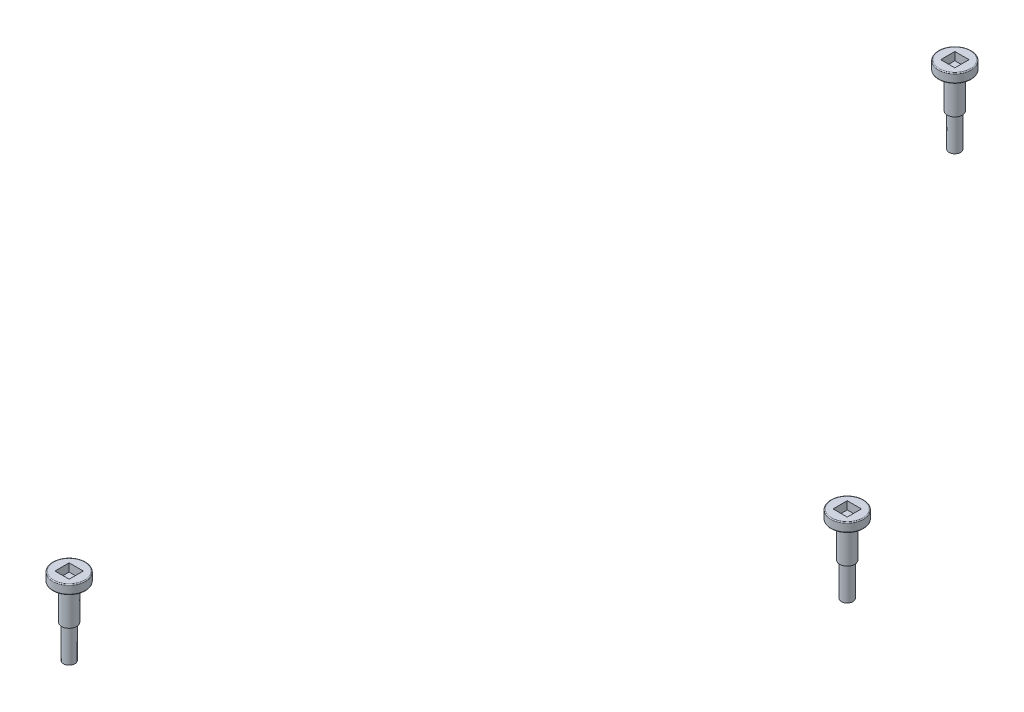
ISO-10303-21;
HEADER;
FILE_DESCRIPTION(('STEP AP214'),'2;1');
FILE_NAME('part.step','',(''),(''),'','','');
FILE_SCHEMA(('AUTOMOTIVE_DESIGN { 1 0 10303 214 1 1 1 1 }'));
ENDSEC;
DATA;
#1=APPLICATION_CONTEXT('core data for automotive mechanical design processes');
#2=APPLICATION_PROTOCOL_DEFINITION('international standard','automotive_design',2000,#1);
#3=PRODUCT_CONTEXT('',#1,'mechanical');
#4=PRODUCT('Part','Part','',(#3));
#5=PRODUCT_RELATED_PRODUCT_CATEGORY('part','',(#4));
#6=PRODUCT_DEFINITION_FORMATION('','',#4);
#7=PRODUCT_DEFINITION_CONTEXT('part definition',#1,'design');
#8=PRODUCT_DEFINITION('design','',#6,#7);
#9=PRODUCT_DEFINITION_SHAPE('','',#8);
#10=(LENGTH_UNIT() NAMED_UNIT(*) SI_UNIT(.MILLI.,.METRE.));
#11=(NAMED_UNIT(*) PLANE_ANGLE_UNIT() SI_UNIT($,.RADIAN.));
#12=(NAMED_UNIT(*) SI_UNIT($,.STERADIAN.) SOLID_ANGLE_UNIT());
#13=UNCERTAINTY_MEASURE_WITH_UNIT(LENGTH_MEASURE(1.E-05),#10,'distance_accuracy_value','');
#14=(GEOMETRIC_REPRESENTATION_CONTEXT(3) GLOBAL_UNCERTAINTY_ASSIGNED_CONTEXT((#13)) GLOBAL_UNIT_ASSIGNED_CONTEXT((#10,
#11,#12)) REPRESENTATION_CONTEXT('',''));
#15=CARTESIAN_POINT('',(0.,0.,0.));
#16=DIRECTION('',(0.,0.,1.));
#17=DIRECTION('',(1.,0.,0.));
#18=AXIS2_PLACEMENT_3D('',#15,#16,#17);
#19=CARTESIAN_POINT('',(-96.139,-2.667,127.));
#20=DIRECTION('',(0.,1.,0.));
#21=DIRECTION('',(0.,0.,1.));
#22=AXIS2_PLACEMENT_3D('',#19,#20,#21);
#23=CYLINDRICAL_SURFACE('',#22,4.69899999999999);
#24=CARTESIAN_POINT('',(-96.139,-2.413,127.));
#25=DIRECTION('',(0.,1.,0.));
#26=DIRECTION('',(0.,0.,1.));
#27=AXIS2_PLACEMENT_3D('',#24,#25,#26);
#28=CIRCLE('',#27,4.69899999999999);
#29=CARTESIAN_POINT('',(-96.139,-2.413,131.699));
#30=VERTEX_POINT('',#29);
#31=EDGE_CURVE('E138',#30,#30,#28,.T.);
#32=ORIENTED_EDGE('',*,*,#31,.T.);
#33=EDGE_LOOP('',(#32));
#34=FACE_BOUND('',#33,.T.);
#35=CARTESIAN_POINT('',(-96.139,-0.254,127.));
#36=DIRECTION('',(0.,1.,0.));
#37=DIRECTION('',(0.,0.,1.));
#38=AXIS2_PLACEMENT_3D('',#35,#36,#37);
#39=CIRCLE('',#38,4.69899999999999);
#40=CARTESIAN_POINT('',(-96.139,-0.254,131.699));
#41=VERTEX_POINT('',#40);
#42=EDGE_CURVE('E133',#41,#41,#39,.F.);
#43=ORIENTED_EDGE('',*,*,#42,.T.);
#44=EDGE_LOOP('',(#43));
#45=FACE_BOUND('',#44,.T.);
#46=ADVANCED_FACE('F45',(#34,#45),#23,.T.);
#47=CARTESIAN_POINT('',(-96.139,-2.667,127.));
#48=DIRECTION('',(0.,1.,0.));
#49=DIRECTION('',(0.,0.,1.));
#50=AXIS2_PLACEMENT_3D('',#47,#48,#49);
#51=PLANE('',#50);
#52=CARTESIAN_POINT('',(-96.139,-2.667,127.));
#53=DIRECTION('',(0.,1.,0.));
#54=DIRECTION('',(0.,0.,1.));
#55=AXIS2_PLACEMENT_3D('',#52,#53,#54);
#56=CIRCLE('',#55,4.44499999999999);
#57=CARTESIAN_POINT('',(-96.139,-2.667,131.445));
#58=VERTEX_POINT('',#57);
#59=EDGE_CURVE('E53',#58,#58,#56,.F.);
#60=ORIENTED_EDGE('',*,*,#59,.T.);
#61=EDGE_LOOP('',(#60));
#62=FACE_BOUND('',#61,.T.);
#63=CARTESIAN_POINT('',(-96.139,-2.667,127.));
#64=DIRECTION('',(0.,1.,0.));
#65=DIRECTION('',(0.,0.,1.));
#66=AXIS2_PLACEMENT_3D('',#63,#64,#65);
#67=CIRCLE('',#66,2.15899999999999);
#68=CARTESIAN_POINT('',(-96.139,-2.667,129.159));
#69=VERTEX_POINT('',#68);
#70=EDGE_CURVE('E130',#69,#69,#67,.T.);
#71=ORIENTED_EDGE('',*,*,#70,.T.);
#72=EDGE_LOOP('',(#71));
#73=FACE_BOUND('',#72,.T.);
#74=ADVANCED_FACE('F143',(#62,#73),#51,.F.);
#75=CARTESIAN_POINT('',(-96.139,0.,127.));
#76=DIRECTION('',(0.,1.,0.));
#77=DIRECTION('',(0.,0.,1.));
#78=AXIS2_PLACEMENT_3D('',#75,#76,#77);
#79=PLANE('',#78);
#80=CARTESIAN_POINT('',(-96.139,0.,127.));
#81=DIRECTION('',(0.,1.,0.));
#82=DIRECTION('',(0.,0.,1.));
#83=AXIS2_PLACEMENT_3D('',#80,#81,#82);
#84=CIRCLE('',#83,4.44499999999999);
#85=CARTESIAN_POINT('',(-96.139,0.,131.445));
#86=VERTEX_POINT('',#85);
#87=EDGE_CURVE('E12',#86,#86,#84,.T.);
#88=ORIENTED_EDGE('',*,*,#87,.T.);
#89=EDGE_LOOP('',(#88));
#90=FACE_BOUND('',#89,.T.);
#91=DIRECTION('',(0.,0.,1.));
#92=VECTOR('',#91,1.);
#93=CARTESIAN_POINT('',(-98.171,0.,124.968));
#94=LINE('',#93,#92);
#95=CARTESIAN_POINT('',(-98.171,0.,124.968));
#96=VERTEX_POINT('',#95);
#97=CARTESIAN_POINT('',(-98.171,0.,129.032));
#98=VERTEX_POINT('',#97);
#99=EDGE_CURVE('E60',#96,#98,#94,.T.);
#100=ORIENTED_EDGE('',*,*,#99,.F.);
#101=DIRECTION('',(-1.,0.,0.));
#102=VECTOR('',#101,1.);
#103=CARTESIAN_POINT('',(-98.171,0.,124.968));
#104=LINE('',#103,#102);
#105=CARTESIAN_POINT('',(-94.107,0.,124.968));
#106=VERTEX_POINT('',#105);
#107=EDGE_CURVE('E111',#106,#96,#104,.T.);
#108=ORIENTED_EDGE('',*,*,#107,.F.);
#109=DIRECTION('',(0.,0.,-1.));
#110=VECTOR('',#109,1.);
#111=CARTESIAN_POINT('',(-94.107,0.,124.968));
#112=LINE('',#111,#110);
#113=CARTESIAN_POINT('',(-94.107,0.,129.032));
#114=VERTEX_POINT('',#113);
#115=EDGE_CURVE('E117',#114,#106,#112,.T.);
#116=ORIENTED_EDGE('',*,*,#115,.F.);
#117=DIRECTION('',(1.,0.,0.));
#118=VECTOR('',#117,1.);
#119=CARTESIAN_POINT('',(-98.171,0.,129.032));
#120=LINE('',#119,#118);
#121=EDGE_CURVE('E95',#98,#114,#120,.T.);
#122=ORIENTED_EDGE('',*,*,#121,.F.);
#123=EDGE_LOOP('',(#100,#108,#116,#122));
#124=FACE_BOUND('',#123,.T.);
#125=ADVANCED_FACE('F160',(#90,#124),#79,.T.);
#126=CARTESIAN_POINT('',(-96.139,-12.7,127.));
#127=DIRECTION('',(0.,1.,0.));
#128=DIRECTION('',(0.,0.,1.));
#129=AXIS2_PLACEMENT_3D('',#126,#127,#128);
#130=CYLINDRICAL_SURFACE('',#129,2.15899999999999);
#131=CARTESIAN_POINT('',(-96.139,-12.7,127.));
#132=DIRECTION('',(0.,1.,0.));
#133=DIRECTION('',(0.,0.,1.));
#134=AXIS2_PLACEMENT_3D('',#131,#132,#133);
#135=CIRCLE('',#134,2.15899999999999);
#136=CARTESIAN_POINT('',(-96.139,-12.7,129.159));
#137=VERTEX_POINT('',#136);
#138=EDGE_CURVE('E127',#137,#137,#135,.T.);
#139=ORIENTED_EDGE('',*,*,#138,.T.);
#140=EDGE_LOOP('',(#139));
#141=FACE_BOUND('',#140,.T.);
#142=ORIENTED_EDGE('',*,*,#70,.F.);
#143=EDGE_LOOP('',(#142));
#144=FACE_BOUND('',#143,.T.);
#145=ADVANCED_FACE('F163',(#141,#144),#130,.T.);
#146=CARTESIAN_POINT('',(-96.139,-12.7,127.));
#147=DIRECTION('',(0.,1.,0.));
#148=DIRECTION('',(0.,0.,1.));
#149=AXIS2_PLACEMENT_3D('',#146,#147,#148);
#150=PLANE('',#149);
#151=CARTESIAN_POINT('',(-96.139,-12.7,127.));
#152=DIRECTION('',(0.,1.,0.));
#153=DIRECTION('',(0.,0.,1.));
#154=AXIS2_PLACEMENT_3D('',#151,#152,#153);
#155=CIRCLE('',#154,1.65100000000001);
#156=CARTESIAN_POINT('',(-96.139,-12.7,128.651));
#157=VERTEX_POINT('',#156);
#158=EDGE_CURVE('E126',#157,#157,#155,.T.);
#159=ORIENTED_EDGE('',*,*,#158,.T.);
#160=EDGE_LOOP('',(#159));
#161=FACE_BOUND('',#160,.T.);
#162=ORIENTED_EDGE('',*,*,#138,.F.);
#163=EDGE_LOOP('',(#162));
#164=FACE_BOUND('',#163,.T.);
#165=ADVANCED_FACE('F187',(#161,#164),#150,.F.);
#166=CARTESIAN_POINT('',(-96.139,-22.225,127.));
#167=DIRECTION('',(0.,1.,0.));
#168=DIRECTION('',(0.,0.,1.));
#169=AXIS2_PLACEMENT_3D('',#166,#167,#168);
#170=CYLINDRICAL_SURFACE('',#169,1.65100000000001);
#171=CARTESIAN_POINT('',(-96.139,-22.225,127.));
#172=DIRECTION('',(0.,1.,0.));
#173=DIRECTION('',(0.,0.,1.));
#174=AXIS2_PLACEMENT_3D('',#171,#172,#173);
#175=CIRCLE('',#174,1.65100000000001);
#176=CARTESIAN_POINT('',(-96.139,-22.225,128.651));
#177=VERTEX_POINT('',#176);
#178=EDGE_CURVE('E121',#177,#177,#175,.T.);
#179=ORIENTED_EDGE('',*,*,#178,.T.);
#180=EDGE_LOOP('',(#179));
#181=FACE_BOUND('',#180,.T.);
#182=ORIENTED_EDGE('',*,*,#158,.F.);
#183=EDGE_LOOP('',(#182));
#184=FACE_BOUND('',#183,.T.);
#185=ADVANCED_FACE('F183',(#181,#184),#170,.T.);
#186=CARTESIAN_POINT('',(-96.139,-22.225,127.));
#187=DIRECTION('',(0.,1.,0.));
#188=DIRECTION('',(0.,0.,1.));
#189=AXIS2_PLACEMENT_3D('',#186,#187,#188);
#190=PLANE('',#189);
#191=ORIENTED_EDGE('',*,*,#178,.F.);
#192=EDGE_LOOP('',(#191));
#193=FACE_BOUND('',#192,.T.);
#194=ADVANCED_FACE('F175',(#193),#190,.F.);
#195=CARTESIAN_POINT('',(-98.171,-2.286,124.968));
#196=DIRECTION('',(-1.,0.,0.));
#197=DIRECTION('',(0.,0.,1.));
#198=AXIS2_PLACEMENT_3D('',#195,#196,#197);
#199=PLANE('',#198);
#200=ORIENTED_EDGE('',*,*,#99,.T.);
#201=DIRECTION('',(0.,1.,0.));
#202=VECTOR('',#201,1.);
#203=CARTESIAN_POINT('',(-98.171,-2.286,129.032));
#204=LINE('',#203,#202);
#205=CARTESIAN_POINT('',(-98.171,-2.286,129.032));
#206=VERTEX_POINT('',#205);
#207=EDGE_CURVE('E83',#206,#98,#204,.T.);
#208=ORIENTED_EDGE('',*,*,#207,.F.);
#209=DIRECTION('',(0.,0.,1.));
#210=VECTOR('',#209,1.);
#211=CARTESIAN_POINT('',(-98.171,-2.286,124.968));
#212=LINE('',#211,#210);
#213=CARTESIAN_POINT('',(-98.171,-2.286,124.968));
#214=VERTEX_POINT('',#213);
#215=EDGE_CURVE('E109',#214,#206,#212,.T.);
#216=ORIENTED_EDGE('',*,*,#215,.F.);
#217=DIRECTION('',(0.,1.,0.));
#218=VECTOR('',#217,1.);
#219=CARTESIAN_POINT('',(-98.171,-2.286,124.968));
#220=LINE('',#219,#218);
#221=EDGE_CURVE('E68',#214,#96,#220,.T.);
#222=ORIENTED_EDGE('',*,*,#221,.T.);
#223=EDGE_LOOP('',(#200,#208,#216,#222));
#224=FACE_BOUND('',#223,.T.);
#225=ADVANCED_FACE('F168',(#224),#199,.F.);
#226=CARTESIAN_POINT('',(-98.171,-2.286,124.968));
#227=DIRECTION('',(0.,0.,-1.));
#228=DIRECTION('',(-1.,0.,0.));
#229=AXIS2_PLACEMENT_3D('',#226,#227,#228);
#230=PLANE('',#229);
#231=ORIENTED_EDGE('',*,*,#107,.T.);
#232=ORIENTED_EDGE('',*,*,#221,.F.);
#233=DIRECTION('',(-1.,0.,0.));
#234=VECTOR('',#233,1.);
#235=CARTESIAN_POINT('',(-98.171,-2.286,124.968));
#236=LINE('',#235,#234);
#237=CARTESIAN_POINT('',(-94.107,-2.286,124.968));
#238=VERTEX_POINT('',#237);
#239=EDGE_CURVE('E106',#238,#214,#236,.T.);
#240=ORIENTED_EDGE('',*,*,#239,.F.);
#241=DIRECTION('',(0.,1.,0.));
#242=VECTOR('',#241,1.);
#243=CARTESIAN_POINT('',(-94.107,-2.286,124.968));
#244=LINE('',#243,#242);
#245=EDGE_CURVE('E99',#238,#106,#244,.T.);
#246=ORIENTED_EDGE('',*,*,#245,.T.);
#247=EDGE_LOOP('',(#231,#232,#240,#246));
#248=FACE_BOUND('',#247,.T.);
#249=ADVANCED_FACE('F166',(#248),#230,.F.);
#250=CARTESIAN_POINT('',(-94.107,-2.286,124.968));
#251=DIRECTION('',(1.,0.,0.));
#252=DIRECTION('',(0.,0.,-1.));
#253=AXIS2_PLACEMENT_3D('',#250,#251,#252);
#254=PLANE('',#253);
#255=ORIENTED_EDGE('',*,*,#115,.T.);
#256=ORIENTED_EDGE('',*,*,#245,.F.);
#257=DIRECTION('',(0.,0.,-1.));
#258=VECTOR('',#257,1.);
#259=CARTESIAN_POINT('',(-94.107,-2.286,124.968));
#260=LINE('',#259,#258);
#261=CARTESIAN_POINT('',(-94.107,-2.286,129.032));
#262=VERTEX_POINT('',#261);
#263=EDGE_CURVE('E102',#262,#238,#260,.T.);
#264=ORIENTED_EDGE('',*,*,#263,.F.);
#265=DIRECTION('',(0.,1.,0.));
#266=VECTOR('',#265,1.);
#267=CARTESIAN_POINT('',(-94.107,-2.286,129.032));
#268=LINE('',#267,#266);
#269=EDGE_CURVE('E88',#262,#114,#268,.T.);
#270=ORIENTED_EDGE('',*,*,#269,.T.);
#271=EDGE_LOOP('',(#255,#256,#264,#270));
#272=FACE_BOUND('',#271,.T.);
#273=ADVANCED_FACE('F103',(#272),#254,.F.);
#274=CARTESIAN_POINT('',(-98.171,-2.286,129.032));
#275=DIRECTION('',(0.,0.,1.));
#276=DIRECTION('',(1.,0.,0.));
#277=AXIS2_PLACEMENT_3D('',#274,#275,#276);
#278=PLANE('',#277);
#279=ORIENTED_EDGE('',*,*,#121,.T.);
#280=ORIENTED_EDGE('',*,*,#269,.F.);
#281=DIRECTION('',(1.,0.,0.));
#282=VECTOR('',#281,1.);
#283=CARTESIAN_POINT('',(-98.171,-2.286,129.032));
#284=LINE('',#283,#282);
#285=EDGE_CURVE('E92',#206,#262,#284,.T.);
#286=ORIENTED_EDGE('',*,*,#285,.F.);
#287=ORIENTED_EDGE('',*,*,#207,.T.);
#288=EDGE_LOOP('',(#279,#280,#286,#287));
#289=FACE_BOUND('',#288,.T.);
#290=ADVANCED_FACE('F90',(#289),#278,.F.);
#291=CARTESIAN_POINT('',(0.,-2.286,0.));
#292=DIRECTION('',(0.,1.,0.));
#293=DIRECTION('',(0.,0.,1.));
#294=AXIS2_PLACEMENT_3D('',#291,#292,#293);
#295=PLANE('',#294);
#296=ORIENTED_EDGE('',*,*,#215,.T.);
#297=ORIENTED_EDGE('',*,*,#285,.T.);
#298=ORIENTED_EDGE('',*,*,#263,.T.);
#299=ORIENTED_EDGE('',*,*,#239,.T.);
#300=EDGE_LOOP('',(#296,#297,#298,#299));
#301=FACE_BOUND('',#300,.T.);
#302=ADVANCED_FACE('F108',(#301),#295,.T.);
#303=CARTESIAN_POINT('',(-96.139,-2.413,127.));
#304=DIRECTION('',(0.,1.,0.));
#305=DIRECTION('',(0.,0.,1.));
#306=AXIS2_PLACEMENT_3D('',#303,#304,#305);
#307=TOROIDAL_SURFACE('',#306,4.44499999999999,0.254);
#308=ORIENTED_EDGE('',*,*,#59,.F.);
#309=EDGE_LOOP('',(#308));
#310=FACE_BOUND('',#309,.T.);
#311=ORIENTED_EDGE('',*,*,#31,.F.);
#312=EDGE_LOOP('',(#311));
#313=FACE_BOUND('',#312,.T.);
#314=ADVANCED_FACE('F146',(#310,#313),#307,.T.);
#315=CARTESIAN_POINT('',(-96.139,-0.254,127.));
#316=DIRECTION('',(0.,1.,0.));
#317=DIRECTION('',(0.,0.,1.));
#318=AXIS2_PLACEMENT_3D('',#315,#316,#317);
#319=TOROIDAL_SURFACE('',#318,4.44499999999999,0.254);
#320=ORIENTED_EDGE('',*,*,#42,.F.);
#321=EDGE_LOOP('',(#320));
#322=FACE_BOUND('',#321,.T.);
#323=ORIENTED_EDGE('',*,*,#87,.F.);
#324=EDGE_LOOP('',(#323));
#325=FACE_BOUND('',#324,.T.);
#326=ADVANCED_FACE('F47',(#322,#325),#319,.T.);
#327=CLOSED_SHELL('',(#46,#74,#125,#145,#165,#185,#194,#225,#249,#273,#290,#302,#314,#326));
#328=MANIFOLD_SOLID_BREP('B2',#327);
#329=CARTESIAN_POINT('',(-96.139,-2.667,-127.));
#330=DIRECTION('',(0.,1.,0.));
#331=DIRECTION('',(0.,0.,1.));
#332=AXIS2_PLACEMENT_3D('',#329,#330,#331);
#333=CYLINDRICAL_SURFACE('',#332,4.69899999999999);
#334=CARTESIAN_POINT('',(-96.139,-0.254,-127.));
#335=DIRECTION('',(0.,1.,0.));
#336=DIRECTION('',(0.,0.,1.));
#337=AXIS2_PLACEMENT_3D('',#334,#335,#336);
#338=CIRCLE('',#337,4.69899999999999);
#339=CARTESIAN_POINT('',(-96.139,-0.254,-122.301));
#340=VERTEX_POINT('',#339);
#341=EDGE_CURVE('E305',#340,#340,#338,.F.);
#342=ORIENTED_EDGE('',*,*,#341,.T.);
#343=EDGE_LOOP('',(#342));
#344=FACE_BOUND('',#343,.T.);
#345=CARTESIAN_POINT('',(-96.139,-2.413,-127.));
#346=DIRECTION('',(0.,1.,0.));
#347=DIRECTION('',(0.,0.,1.));
#348=AXIS2_PLACEMENT_3D('',#345,#346,#347);
#349=CIRCLE('',#348,4.69899999999999);
#350=CARTESIAN_POINT('',(-96.139,-2.413,-122.301));
#351=VERTEX_POINT('',#350);
#352=EDGE_CURVE('E390',#351,#351,#349,.T.);
#353=ORIENTED_EDGE('',*,*,#352,.T.);
#354=EDGE_LOOP('',(#353));
#355=FACE_BOUND('',#354,.T.);
#356=ADVANCED_FACE('F297',(#344,#355),#333,.T.);
#357=CARTESIAN_POINT('',(-96.139,-2.667,-127.));
#358=DIRECTION('',(0.,1.,0.));
#359=DIRECTION('',(0.,0.,1.));
#360=AXIS2_PLACEMENT_3D('',#357,#358,#359);
#361=PLANE('',#360);
#362=CARTESIAN_POINT('',(-96.139,-2.667,-127.));
#363=DIRECTION('',(0.,1.,0.));
#364=DIRECTION('',(0.,0.,1.));
#365=AXIS2_PLACEMENT_3D('',#362,#363,#364);
#366=CIRCLE('',#365,4.44499999999999);
#367=CARTESIAN_POINT('',(-96.139,-2.667,-122.555));
#368=VERTEX_POINT('',#367);
#369=EDGE_CURVE('E43',#368,#368,#366,.F.);
#370=ORIENTED_EDGE('',*,*,#369,.T.);
#371=EDGE_LOOP('',(#370));
#372=FACE_BOUND('',#371,.T.);
#373=CARTESIAN_POINT('',(-96.139,-2.667,-127.));
#374=DIRECTION('',(0.,1.,0.));
#375=DIRECTION('',(0.,0.,1.));
#376=AXIS2_PLACEMENT_3D('',#373,#374,#375);
#377=CIRCLE('',#376,2.15899999999999);
#378=CARTESIAN_POINT('',(-96.139,-2.667,-124.841));
#379=VERTEX_POINT('',#378);
#380=EDGE_CURVE('E382',#379,#379,#377,.T.);
#381=ORIENTED_EDGE('',*,*,#380,.T.);
#382=EDGE_LOOP('',(#381));
#383=FACE_BOUND('',#382,.T.);
#384=ADVANCED_FACE('F406',(#372,#383),#361,.F.);
#385=CARTESIAN_POINT('',(-96.139,0.,-127.));
#386=DIRECTION('',(0.,1.,0.));
#387=DIRECTION('',(0.,0.,1.));
#388=AXIS2_PLACEMENT_3D('',#385,#386,#387);
#389=PLANE('',#388);
#390=CARTESIAN_POINT('',(-96.139,0.,-127.));
#391=DIRECTION('',(0.,1.,0.));
#392=DIRECTION('',(0.,0.,1.));
#393=AXIS2_PLACEMENT_3D('',#390,#391,#392);
#394=CIRCLE('',#393,4.44499999999999);
#395=CARTESIAN_POINT('',(-96.139,0.,-122.555));
#396=VERTEX_POINT('',#395);
#397=EDGE_CURVE('E385',#396,#396,#394,.T.);
#398=ORIENTED_EDGE('',*,*,#397,.T.);
#399=EDGE_LOOP('',(#398));
#400=FACE_BOUND('',#399,.T.);
#401=DIRECTION('',(0.,0.,1.));
#402=VECTOR('',#401,1.);
#403=CARTESIAN_POINT('',(-98.171,0.,-129.032));
#404=LINE('',#403,#402);
#405=CARTESIAN_POINT('',(-98.171,0.,-129.032));
#406=VERTEX_POINT('',#405);
#407=CARTESIAN_POINT('',(-98.171,0.,-124.968));
#408=VERTEX_POINT('',#407);
#409=EDGE_CURVE('E312',#406,#408,#404,.T.);
#410=ORIENTED_EDGE('',*,*,#409,.F.);
#411=DIRECTION('',(-1.,0.,0.));
#412=VECTOR('',#411,1.);
#413=CARTESIAN_POINT('',(-98.171,0.,-129.032));
#414=LINE('',#413,#412);
#415=CARTESIAN_POINT('',(-94.107,0.,-129.032));
#416=VERTEX_POINT('',#415);
#417=EDGE_CURVE('E363',#416,#406,#414,.T.);
#418=ORIENTED_EDGE('',*,*,#417,.F.);
#419=DIRECTION('',(0.,0.,-1.));
#420=VECTOR('',#419,1.);
#421=CARTESIAN_POINT('',(-94.107,0.,-129.032));
#422=LINE('',#421,#420);
#423=CARTESIAN_POINT('',(-94.107,0.,-124.968));
#424=VERTEX_POINT('',#423);
#425=EDGE_CURVE('E369',#424,#416,#422,.T.);
#426=ORIENTED_EDGE('',*,*,#425,.F.);
#427=DIRECTION('',(1.,0.,0.));
#428=VECTOR('',#427,1.);
#429=CARTESIAN_POINT('',(-98.171,0.,-124.968));
#430=LINE('',#429,#428);
#431=EDGE_CURVE('E347',#408,#424,#430,.T.);
#432=ORIENTED_EDGE('',*,*,#431,.F.);
#433=EDGE_LOOP('',(#410,#418,#426,#432));
#434=FACE_BOUND('',#433,.T.);
#435=ADVANCED_FACE('F402',(#400,#434),#389,.T.);
#436=CARTESIAN_POINT('',(-96.139,-12.7,-127.));
#437=DIRECTION('',(0.,1.,0.));
#438=DIRECTION('',(0.,0.,1.));
#439=AXIS2_PLACEMENT_3D('',#436,#437,#438);
#440=CYLINDRICAL_SURFACE('',#439,2.15899999999999);
#441=CARTESIAN_POINT('',(-96.139,-12.7,-127.));
#442=DIRECTION('',(0.,1.,0.));
#443=DIRECTION('',(0.,0.,1.));
#444=AXIS2_PLACEMENT_3D('',#441,#442,#443);
#445=CIRCLE('',#444,2.15899999999999);
#446=CARTESIAN_POINT('',(-96.139,-12.7,-124.841));
#447=VERTEX_POINT('',#446);
#448=EDGE_CURVE('E379',#447,#447,#445,.T.);
#449=ORIENTED_EDGE('',*,*,#448,.T.);
#450=EDGE_LOOP('',(#449));
#451=FACE_BOUND('',#450,.T.);
#452=ORIENTED_EDGE('',*,*,#380,.F.);
#453=EDGE_LOOP('',(#452));
#454=FACE_BOUND('',#453,.T.);
#455=ADVANCED_FACE('F405',(#451,#454),#440,.T.);
#456=CARTESIAN_POINT('',(-96.139,-12.7,-127.));
#457=DIRECTION('',(0.,1.,0.));
#458=DIRECTION('',(0.,0.,1.));
#459=AXIS2_PLACEMENT_3D('',#456,#457,#458);
#460=PLANE('',#459);
#461=CARTESIAN_POINT('',(-96.139,-12.7,-127.));
#462=DIRECTION('',(0.,1.,0.));
#463=DIRECTION('',(0.,0.,1.));
#464=AXIS2_PLACEMENT_3D('',#461,#462,#463);
#465=CIRCLE('',#464,1.65100000000001);
#466=CARTESIAN_POINT('',(-96.139,-12.7,-125.349));
#467=VERTEX_POINT('',#466);
#468=EDGE_CURVE('E378',#467,#467,#465,.T.);
#469=ORIENTED_EDGE('',*,*,#468,.T.);
#470=EDGE_LOOP('',(#469));
#471=FACE_BOUND('',#470,.T.);
#472=ORIENTED_EDGE('',*,*,#448,.F.);
#473=EDGE_LOOP('',(#472));
#474=FACE_BOUND('',#473,.T.);
#475=ADVANCED_FACE('F431',(#471,#474),#460,.F.);
#476=CARTESIAN_POINT('',(-96.139,-22.225,-127.));
#477=DIRECTION('',(0.,1.,0.));
#478=DIRECTION('',(0.,0.,1.));
#479=AXIS2_PLACEMENT_3D('',#476,#477,#478);
#480=CYLINDRICAL_SURFACE('',#479,1.65100000000001);
#481=CARTESIAN_POINT('',(-96.139,-22.225,-127.));
#482=DIRECTION('',(0.,1.,0.));
#483=DIRECTION('',(0.,0.,1.));
#484=AXIS2_PLACEMENT_3D('',#481,#482,#483);
#485=CIRCLE('',#484,1.65100000000001);
#486=CARTESIAN_POINT('',(-96.139,-22.225,-125.349));
#487=VERTEX_POINT('',#486);
#488=EDGE_CURVE('E373',#487,#487,#485,.T.);
#489=ORIENTED_EDGE('',*,*,#488,.T.);
#490=EDGE_LOOP('',(#489));
#491=FACE_BOUND('',#490,.T.);
#492=ORIENTED_EDGE('',*,*,#468,.F.);
#493=EDGE_LOOP('',(#492));
#494=FACE_BOUND('',#493,.T.);
#495=ADVANCED_FACE('F435',(#491,#494),#480,.T.);
#496=CARTESIAN_POINT('',(-96.139,-22.225,-127.));
#497=DIRECTION('',(0.,1.,0.));
#498=DIRECTION('',(0.,0.,1.));
#499=AXIS2_PLACEMENT_3D('',#496,#497,#498);
#500=PLANE('',#499);
#501=ORIENTED_EDGE('',*,*,#488,.F.);
#502=EDGE_LOOP('',(#501));
#503=FACE_BOUND('',#502,.T.);
#504=ADVANCED_FACE('F418',(#503),#500,.F.);
#505=CARTESIAN_POINT('',(-98.171,-2.286,-129.032));
#506=DIRECTION('',(-1.,0.,0.));
#507=DIRECTION('',(0.,0.,1.));
#508=AXIS2_PLACEMENT_3D('',#505,#506,#507);
#509=PLANE('',#508);
#510=ORIENTED_EDGE('',*,*,#409,.T.);
#511=DIRECTION('',(0.,1.,0.));
#512=VECTOR('',#511,1.);
#513=CARTESIAN_POINT('',(-98.171,-2.286,-124.968));
#514=LINE('',#513,#512);
#515=CARTESIAN_POINT('',(-98.171,-2.286,-124.968));
#516=VERTEX_POINT('',#515);
#517=EDGE_CURVE('E335',#516,#408,#514,.T.);
#518=ORIENTED_EDGE('',*,*,#517,.F.);
#519=DIRECTION('',(0.,0.,1.));
#520=VECTOR('',#519,1.);
#521=CARTESIAN_POINT('',(-98.171,-2.286,-129.032));
#522=LINE('',#521,#520);
#523=CARTESIAN_POINT('',(-98.171,-2.286,-129.032));
#524=VERTEX_POINT('',#523);
#525=EDGE_CURVE('E361',#524,#516,#522,.T.);
#526=ORIENTED_EDGE('',*,*,#525,.F.);
#527=DIRECTION('',(0.,1.,0.));
#528=VECTOR('',#527,1.);
#529=CARTESIAN_POINT('',(-98.171,-2.286,-129.032));
#530=LINE('',#529,#528);
#531=EDGE_CURVE('E320',#524,#406,#530,.T.);
#532=ORIENTED_EDGE('',*,*,#531,.T.);
#533=EDGE_LOOP('',(#510,#518,#526,#532));
#534=FACE_BOUND('',#533,.T.);
#535=ADVANCED_FACE('F411',(#534),#509,.F.);
#536=CARTESIAN_POINT('',(-98.171,-2.286,-129.032));
#537=DIRECTION('',(0.,0.,-1.));
#538=DIRECTION('',(-1.,0.,0.));
#539=AXIS2_PLACEMENT_3D('',#536,#537,#538);
#540=PLANE('',#539);
#541=ORIENTED_EDGE('',*,*,#417,.T.);
#542=ORIENTED_EDGE('',*,*,#531,.F.);
#543=DIRECTION('',(-1.,0.,0.));
#544=VECTOR('',#543,1.);
#545=CARTESIAN_POINT('',(-98.171,-2.286,-129.032));
#546=LINE('',#545,#544);
#547=CARTESIAN_POINT('',(-94.107,-2.286,-129.032));
#548=VERTEX_POINT('',#547);
#549=EDGE_CURVE('E358',#548,#524,#546,.T.);
#550=ORIENTED_EDGE('',*,*,#549,.F.);
#551=DIRECTION('',(0.,1.,0.));
#552=VECTOR('',#551,1.);
#553=CARTESIAN_POINT('',(-94.107,-2.286,-129.032));
#554=LINE('',#553,#552);
#555=EDGE_CURVE('E351',#548,#416,#554,.T.);
#556=ORIENTED_EDGE('',*,*,#555,.T.);
#557=EDGE_LOOP('',(#541,#542,#550,#556));
#558=FACE_BOUND('',#557,.T.);
#559=ADVANCED_FACE('F409',(#558),#540,.F.);
#560=CARTESIAN_POINT('',(-94.107,-2.286,-129.032));
#561=DIRECTION('',(1.,0.,0.));
#562=DIRECTION('',(0.,0.,-1.));
#563=AXIS2_PLACEMENT_3D('',#560,#561,#562);
#564=PLANE('',#563);
#565=ORIENTED_EDGE('',*,*,#425,.T.);
#566=ORIENTED_EDGE('',*,*,#555,.F.);
#567=DIRECTION('',(0.,0.,-1.));
#568=VECTOR('',#567,1.);
#569=CARTESIAN_POINT('',(-94.107,-2.286,-129.032));
#570=LINE('',#569,#568);
#571=CARTESIAN_POINT('',(-94.107,-2.286,-124.968));
#572=VERTEX_POINT('',#571);
#573=EDGE_CURVE('E354',#572,#548,#570,.T.);
#574=ORIENTED_EDGE('',*,*,#573,.F.);
#575=DIRECTION('',(0.,1.,0.));
#576=VECTOR('',#575,1.);
#577=CARTESIAN_POINT('',(-94.107,-2.286,-124.968));
#578=LINE('',#577,#576);
#579=EDGE_CURVE('E340',#572,#424,#578,.T.);
#580=ORIENTED_EDGE('',*,*,#579,.T.);
#581=EDGE_LOOP('',(#565,#566,#574,#580));
#582=FACE_BOUND('',#581,.T.);
#583=ADVANCED_FACE('F355',(#582),#564,.F.);
#584=CARTESIAN_POINT('',(-98.171,-2.286,-124.968));
#585=DIRECTION('',(0.,0.,1.));
#586=DIRECTION('',(1.,0.,0.));
#587=AXIS2_PLACEMENT_3D('',#584,#585,#586);
#588=PLANE('',#587);
#589=ORIENTED_EDGE('',*,*,#431,.T.);
#590=ORIENTED_EDGE('',*,*,#579,.F.);
#591=DIRECTION('',(1.,0.,0.));
#592=VECTOR('',#591,1.);
#593=CARTESIAN_POINT('',(-98.171,-2.286,-124.968));
#594=LINE('',#593,#592);
#595=EDGE_CURVE('E344',#516,#572,#594,.T.);
#596=ORIENTED_EDGE('',*,*,#595,.F.);
#597=ORIENTED_EDGE('',*,*,#517,.T.);
#598=EDGE_LOOP('',(#589,#590,#596,#597));
#599=FACE_BOUND('',#598,.T.);
#600=ADVANCED_FACE('F342',(#599),#588,.F.);
#601=CARTESIAN_POINT('',(0.,-2.286,0.));
#602=DIRECTION('',(0.,1.,0.));
#603=DIRECTION('',(0.,0.,1.));
#604=AXIS2_PLACEMENT_3D('',#601,#602,#603);
#605=PLANE('',#604);
#606=ORIENTED_EDGE('',*,*,#525,.T.);
#607=ORIENTED_EDGE('',*,*,#595,.T.);
#608=ORIENTED_EDGE('',*,*,#573,.T.);
#609=ORIENTED_EDGE('',*,*,#549,.T.);
#610=EDGE_LOOP('',(#606,#607,#608,#609));
#611=FACE_BOUND('',#610,.T.);
#612=ADVANCED_FACE('F360',(#611),#605,.T.);
#613=CARTESIAN_POINT('',(-96.139,-0.254,-127.));
#614=DIRECTION('',(0.,1.,0.));
#615=DIRECTION('',(0.,0.,1.));
#616=AXIS2_PLACEMENT_3D('',#613,#614,#615);
#617=TOROIDAL_SURFACE('',#616,4.44499999999999,0.254);
#618=ORIENTED_EDGE('',*,*,#341,.F.);
#619=EDGE_LOOP('',(#618));
#620=FACE_BOUND('',#619,.T.);
#621=ORIENTED_EDGE('',*,*,#397,.F.);
#622=EDGE_LOOP('',(#621));
#623=FACE_BOUND('',#622,.T.);
#624=ADVANCED_FACE('F397',(#620,#623),#617,.T.);
#625=CARTESIAN_POINT('',(-96.139,-2.413,-127.));
#626=DIRECTION('',(0.,1.,0.));
#627=DIRECTION('',(0.,0.,1.));
#628=AXIS2_PLACEMENT_3D('',#625,#626,#627);
#629=TOROIDAL_SURFACE('',#628,4.44499999999999,0.254);
#630=ORIENTED_EDGE('',*,*,#369,.F.);
#631=EDGE_LOOP('',(#630));
#632=FACE_BOUND('',#631,.T.);
#633=ORIENTED_EDGE('',*,*,#352,.F.);
#634=EDGE_LOOP('',(#633));
#635=FACE_BOUND('',#634,.T.);
#636=ADVANCED_FACE('F299',(#632,#635),#629,.T.);
#637=CLOSED_SHELL('',(#356,#384,#435,#455,#475,#495,#504,#535,#559,#583,#600,#612,#624,#636));
#638=MANIFOLD_SOLID_BREP('B6',#637);
#639=CARTESIAN_POINT('',(0.,-2.667,0.));
#640=DIRECTION('',(0.,1.,0.));
#641=DIRECTION('',(0.,0.,1.));
#642=AXIS2_PLACEMENT_3D('',#639,#640,#641);
#643=CYLINDRICAL_SURFACE('',#642,4.699);
#644=CARTESIAN_POINT('',(0.,-2.413,0.));
#645=DIRECTION('',(0.,1.,0.));
#646=DIRECTION('',(0.,0.,1.));
#647=AXIS2_PLACEMENT_3D('',#644,#645,#646);
#648=CIRCLE('',#647,4.699);
#649=CARTESIAN_POINT('',(0.,-2.413,4.699));
#650=VERTEX_POINT('',#649);
#651=EDGE_CURVE('E633',#650,#650,#648,.T.);
#652=ORIENTED_EDGE('',*,*,#651,.T.);
#653=EDGE_LOOP('',(#652));
#654=FACE_BOUND('',#653,.T.);
#655=CARTESIAN_POINT('',(0.,-0.254,0.));
#656=DIRECTION('',(0.,1.,0.));
#657=DIRECTION('',(0.,0.,1.));
#658=AXIS2_PLACEMENT_3D('',#655,#656,#657);
#659=CIRCLE('',#658,4.699);
#660=CARTESIAN_POINT('',(0.,-0.254,4.699));
#661=VERTEX_POINT('',#660);
#662=EDGE_CURVE('E628',#661,#661,#659,.F.);
#663=ORIENTED_EDGE('',*,*,#662,.T.);
#664=EDGE_LOOP('',(#663));
#665=FACE_BOUND('',#664,.T.);
#666=ADVANCED_FACE('F540',(#654,#665),#643,.T.);
#667=CARTESIAN_POINT('',(0.,-2.667,0.));
#668=DIRECTION('',(0.,1.,0.));
#669=DIRECTION('',(0.,0.,1.));
#670=AXIS2_PLACEMENT_3D('',#667,#668,#669);
#671=PLANE('',#670);
#672=CARTESIAN_POINT('',(0.,-2.667,0.));
#673=DIRECTION('',(0.,1.,0.));
#674=DIRECTION('',(0.,0.,1.));
#675=AXIS2_PLACEMENT_3D('',#672,#673,#674);
#676=CIRCLE('',#675,4.445);
#677=CARTESIAN_POINT('',(0.,-2.667,4.445));
#678=VERTEX_POINT('',#677);
#679=EDGE_CURVE('E548',#678,#678,#676,.F.);
#680=ORIENTED_EDGE('',*,*,#679,.T.);
#681=EDGE_LOOP('',(#680));
#682=FACE_BOUND('',#681,.T.);
#683=CARTESIAN_POINT('',(0.,-2.667,0.));
#684=DIRECTION('',(0.,1.,0.));
#685=DIRECTION('',(0.,0.,1.));
#686=AXIS2_PLACEMENT_3D('',#683,#684,#685);
#687=CIRCLE('',#686,2.159);
#688=CARTESIAN_POINT('',(0.,-2.667,2.159));
#689=VERTEX_POINT('',#688);
#690=EDGE_CURVE('E625',#689,#689,#687,.T.);
#691=ORIENTED_EDGE('',*,*,#690,.T.);
#692=EDGE_LOOP('',(#691));
#693=FACE_BOUND('',#692,.T.);
#694=ADVANCED_FACE('F638',(#682,#693),#671,.F.);
#695=CARTESIAN_POINT('',(0.,0.,0.));
#696=DIRECTION('',(0.,1.,0.));
#697=DIRECTION('',(0.,0.,1.));
#698=AXIS2_PLACEMENT_3D('',#695,#696,#697);
#699=PLANE('',#698);
#700=CARTESIAN_POINT('',(0.,0.,0.));
#701=DIRECTION('',(0.,1.,0.));
#702=DIRECTION('',(0.,0.,1.));
#703=AXIS2_PLACEMENT_3D('',#700,#701,#702);
#704=CIRCLE('',#703,4.445);
#705=CARTESIAN_POINT('',(0.,0.,4.445));
#706=VERTEX_POINT('',#705);
#707=EDGE_CURVE('E295',#706,#706,#704,.T.);
#708=ORIENTED_EDGE('',*,*,#707,.T.);
#709=EDGE_LOOP('',(#708));
#710=FACE_BOUND('',#709,.T.);
#711=DIRECTION('',(0.,0.,1.));
#712=VECTOR('',#711,1.);
#713=CARTESIAN_POINT('',(-2.032,0.,-2.032));
#714=LINE('',#713,#712);
#715=CARTESIAN_POINT('',(-2.032,0.,-2.032));
#716=VERTEX_POINT('',#715);
#717=CARTESIAN_POINT('',(-2.032,0.,2.032));
#718=VERTEX_POINT('',#717);
#719=EDGE_CURVE('E555',#716,#718,#714,.T.);
#720=ORIENTED_EDGE('',*,*,#719,.F.);
#721=DIRECTION('',(-1.,0.,0.));
#722=VECTOR('',#721,1.);
#723=CARTESIAN_POINT('',(-2.032,0.,-2.032));
#724=LINE('',#723,#722);
#725=CARTESIAN_POINT('',(2.032,0.,-2.032));
#726=VERTEX_POINT('',#725);
#727=EDGE_CURVE('E606',#726,#716,#724,.T.);
#728=ORIENTED_EDGE('',*,*,#727,.F.);
#729=DIRECTION('',(0.,0.,-1.));
#730=VECTOR('',#729,1.);
#731=CARTESIAN_POINT('',(2.032,0.,-2.032));
#732=LINE('',#731,#730);
#733=CARTESIAN_POINT('',(2.032,0.,2.032));
#734=VERTEX_POINT('',#733);
#735=EDGE_CURVE('E612',#734,#726,#732,.T.);
#736=ORIENTED_EDGE('',*,*,#735,.F.);
#737=DIRECTION('',(1.,0.,0.));
#738=VECTOR('',#737,1.);
#739=CARTESIAN_POINT('',(-2.032,0.,2.032));
#740=LINE('',#739,#738);
#741=EDGE_CURVE('E590',#718,#734,#740,.T.);
#742=ORIENTED_EDGE('',*,*,#741,.F.);
#743=EDGE_LOOP('',(#720,#728,#736,#742));
#744=FACE_BOUND('',#743,.T.);
#745=ADVANCED_FACE('F655',(#710,#744),#699,.T.);
#746=CARTESIAN_POINT('',(0.,-12.7,0.));
#747=DIRECTION('',(0.,1.,0.));
#748=DIRECTION('',(0.,0.,1.));
#749=AXIS2_PLACEMENT_3D('',#746,#747,#748);
#750=CYLINDRICAL_SURFACE('',#749,2.159);
#751=CARTESIAN_POINT('',(0.,-12.7,0.));
#752=DIRECTION('',(0.,1.,0.));
#753=DIRECTION('',(0.,0.,1.));
#754=AXIS2_PLACEMENT_3D('',#751,#752,#753);
#755=CIRCLE('',#754,2.159);
#756=CARTESIAN_POINT('',(0.,-12.7,2.159));
#757=VERTEX_POINT('',#756);
#758=EDGE_CURVE('E622',#757,#757,#755,.T.);
#759=ORIENTED_EDGE('',*,*,#758,.T.);
#760=EDGE_LOOP('',(#759));
#761=FACE_BOUND('',#760,.T.);
#762=ORIENTED_EDGE('',*,*,#690,.F.);
#763=EDGE_LOOP('',(#762));
#764=FACE_BOUND('',#763,.T.);
#765=ADVANCED_FACE('F658',(#761,#764),#750,.T.);
#766=CARTESIAN_POINT('',(0.,-12.7,0.));
#767=DIRECTION('',(0.,1.,0.));
#768=DIRECTION('',(0.,0.,1.));
#769=AXIS2_PLACEMENT_3D('',#766,#767,#768);
#770=PLANE('',#769);
#771=CARTESIAN_POINT('',(0.,-12.7,0.));
#772=DIRECTION('',(0.,1.,0.));
#773=DIRECTION('',(0.,0.,1.));
#774=AXIS2_PLACEMENT_3D('',#771,#772,#773);
#775=CIRCLE('',#774,1.651);
#776=CARTESIAN_POINT('',(0.,-12.7,1.651));
#777=VERTEX_POINT('',#776);
#778=EDGE_CURVE('E621',#777,#777,#775,.T.);
#779=ORIENTED_EDGE('',*,*,#778,.T.);
#780=EDGE_LOOP('',(#779));
#781=FACE_BOUND('',#780,.T.);
#782=ORIENTED_EDGE('',*,*,#758,.F.);
#783=EDGE_LOOP('',(#782));
#784=FACE_BOUND('',#783,.T.);
#785=ADVANCED_FACE('F682',(#781,#784),#770,.F.);
#786=CARTESIAN_POINT('',(0.,-22.225,0.));
#787=DIRECTION('',(0.,1.,0.));
#788=DIRECTION('',(0.,0.,1.));
#789=AXIS2_PLACEMENT_3D('',#786,#787,#788);
#790=CYLINDRICAL_SURFACE('',#789,1.651);
#791=CARTESIAN_POINT('',(0.,-22.225,0.));
#792=DIRECTION('',(0.,1.,0.));
#793=DIRECTION('',(0.,0.,1.));
#794=AXIS2_PLACEMENT_3D('',#791,#792,#793);
#795=CIRCLE('',#794,1.651);
#796=CARTESIAN_POINT('',(0.,-22.225,1.651));
#797=VERTEX_POINT('',#796);
#798=EDGE_CURVE('E616',#797,#797,#795,.T.);
#799=ORIENTED_EDGE('',*,*,#798,.T.);
#800=EDGE_LOOP('',(#799));
#801=FACE_BOUND('',#800,.T.);
#802=ORIENTED_EDGE('',*,*,#778,.F.);
#803=EDGE_LOOP('',(#802));
#804=FACE_BOUND('',#803,.T.);
#805=ADVANCED_FACE('F678',(#801,#804),#790,.T.);
#806=CARTESIAN_POINT('',(0.,-22.225,0.));
#807=DIRECTION('',(0.,1.,0.));
#808=DIRECTION('',(0.,0.,1.));
#809=AXIS2_PLACEMENT_3D('',#806,#807,#808);
#810=PLANE('',#809);
#811=ORIENTED_EDGE('',*,*,#798,.F.);
#812=EDGE_LOOP('',(#811));
#813=FACE_BOUND('',#812,.T.);
#814=ADVANCED_FACE('F670',(#813),#810,.F.);
#815=CARTESIAN_POINT('',(-2.032,-2.286,-2.032));
#816=DIRECTION('',(-1.,0.,0.));
#817=DIRECTION('',(0.,0.,1.));
#818=AXIS2_PLACEMENT_3D('',#815,#816,#817);
#819=PLANE('',#818);
#820=ORIENTED_EDGE('',*,*,#719,.T.);
#821=DIRECTION('',(0.,1.,0.));
#822=VECTOR('',#821,1.);
#823=CARTESIAN_POINT('',(-2.032,-2.286,2.032));
#824=LINE('',#823,#822);
#825=CARTESIAN_POINT('',(-2.032,-2.286,2.032));
#826=VERTEX_POINT('',#825);
#827=EDGE_CURVE('E578',#826,#718,#824,.T.);
#828=ORIENTED_EDGE('',*,*,#827,.F.);
#829=DIRECTION('',(0.,0.,1.));
#830=VECTOR('',#829,1.);
#831=CARTESIAN_POINT('',(-2.032,-2.286,-2.032));
#832=LINE('',#831,#830);
#833=CARTESIAN_POINT('',(-2.032,-2.286,-2.032));
#834=VERTEX_POINT('',#833);
#835=EDGE_CURVE('E604',#834,#826,#832,.T.);
#836=ORIENTED_EDGE('',*,*,#835,.F.);
#837=DIRECTION('',(0.,1.,0.));
#838=VECTOR('',#837,1.);
#839=CARTESIAN_POINT('',(-2.032,-2.286,-2.032));
#840=LINE('',#839,#838);
#841=EDGE_CURVE('E563',#834,#716,#840,.T.);
#842=ORIENTED_EDGE('',*,*,#841,.T.);
#843=EDGE_LOOP('',(#820,#828,#836,#842));
#844=FACE_BOUND('',#843,.T.);
#845=ADVANCED_FACE('F663',(#844),#819,.F.);
#846=CARTESIAN_POINT('',(-2.032,-2.286,-2.032));
#847=DIRECTION('',(0.,0.,-1.));
#848=DIRECTION('',(-1.,0.,0.));
#849=AXIS2_PLACEMENT_3D('',#846,#847,#848);
#850=PLANE('',#849);
#851=ORIENTED_EDGE('',*,*,#727,.T.);
#852=ORIENTED_EDGE('',*,*,#841,.F.);
#853=DIRECTION('',(-1.,0.,0.));
#854=VECTOR('',#853,1.);
#855=CARTESIAN_POINT('',(-2.032,-2.286,-2.032));
#856=LINE('',#855,#854);
#857=CARTESIAN_POINT('',(2.032,-2.286,-2.032));
#858=VERTEX_POINT('',#857);
#859=EDGE_CURVE('E601',#858,#834,#856,.T.);
#860=ORIENTED_EDGE('',*,*,#859,.F.);
#861=DIRECTION('',(0.,1.,0.));
#862=VECTOR('',#861,1.);
#863=CARTESIAN_POINT('',(2.032,-2.286,-2.032));
#864=LINE('',#863,#862);
#865=EDGE_CURVE('E594',#858,#726,#864,.T.);
#866=ORIENTED_EDGE('',*,*,#865,.T.);
#867=EDGE_LOOP('',(#851,#852,#860,#866));
#868=FACE_BOUND('',#867,.T.);
#869=ADVANCED_FACE('F661',(#868),#850,.F.);
#870=CARTESIAN_POINT('',(2.032,-2.286,-2.032));
#871=DIRECTION('',(1.,0.,0.));
#872=DIRECTION('',(0.,0.,-1.));
#873=AXIS2_PLACEMENT_3D('',#870,#871,#872);
#874=PLANE('',#873);
#875=ORIENTED_EDGE('',*,*,#735,.T.);
#876=ORIENTED_EDGE('',*,*,#865,.F.);
#877=DIRECTION('',(0.,0.,-1.));
#878=VECTOR('',#877,1.);
#879=CARTESIAN_POINT('',(2.032,-2.286,-2.032));
#880=LINE('',#879,#878);
#881=CARTESIAN_POINT('',(2.032,-2.286,2.032));
#882=VERTEX_POINT('',#881);
#883=EDGE_CURVE('E597',#882,#858,#880,.T.);
#884=ORIENTED_EDGE('',*,*,#883,.F.);
#885=DIRECTION('',(0.,1.,0.));
#886=VECTOR('',#885,1.);
#887=CARTESIAN_POINT('',(2.032,-2.286,2.032));
#888=LINE('',#887,#886);
#889=EDGE_CURVE('E583',#882,#734,#888,.T.);
#890=ORIENTED_EDGE('',*,*,#889,.T.);
#891=EDGE_LOOP('',(#875,#876,#884,#890));
#892=FACE_BOUND('',#891,.T.);
#893=ADVANCED_FACE('F598',(#892),#874,.F.);
#894=CARTESIAN_POINT('',(-2.032,-2.286,2.032));
#895=DIRECTION('',(0.,0.,1.));
#896=DIRECTION('',(1.,0.,0.));
#897=AXIS2_PLACEMENT_3D('',#894,#895,#896);
#898=PLANE('',#897);
#899=ORIENTED_EDGE('',*,*,#741,.T.);
#900=ORIENTED_EDGE('',*,*,#889,.F.);
#901=DIRECTION('',(1.,0.,0.));
#902=VECTOR('',#901,1.);
#903=CARTESIAN_POINT('',(-2.032,-2.286,2.032));
#904=LINE('',#903,#902);
#905=EDGE_CURVE('E587',#826,#882,#904,.T.);
#906=ORIENTED_EDGE('',*,*,#905,.F.);
#907=ORIENTED_EDGE('',*,*,#827,.T.);
#908=EDGE_LOOP('',(#899,#900,#906,#907));
#909=FACE_BOUND('',#908,.T.);
#910=ADVANCED_FACE('F585',(#909),#898,.F.);
#911=CARTESIAN_POINT('',(0.,-2.286,0.));
#912=DIRECTION('',(0.,1.,0.));
#913=DIRECTION('',(0.,0.,1.));
#914=AXIS2_PLACEMENT_3D('',#911,#912,#913);
#915=PLANE('',#914);
#916=ORIENTED_EDGE('',*,*,#835,.T.);
#917=ORIENTED_EDGE('',*,*,#905,.T.);
#918=ORIENTED_EDGE('',*,*,#883,.T.);
#919=ORIENTED_EDGE('',*,*,#859,.T.);
#920=EDGE_LOOP('',(#916,#917,#918,#919));
#921=FACE_BOUND('',#920,.T.);
#922=ADVANCED_FACE('F603',(#921),#915,.T.);
#923=CARTESIAN_POINT('',(0.,-2.413,0.));
#924=DIRECTION('',(0.,1.,0.));
#925=DIRECTION('',(0.,0.,1.));
#926=AXIS2_PLACEMENT_3D('',#923,#924,#925);
#927=TOROIDAL_SURFACE('',#926,4.445,0.254);
#928=ORIENTED_EDGE('',*,*,#679,.F.);
#929=EDGE_LOOP('',(#928));
#930=FACE_BOUND('',#929,.T.);
#931=ORIENTED_EDGE('',*,*,#651,.F.);
#932=EDGE_LOOP('',(#931));
#933=FACE_BOUND('',#932,.T.);
#934=ADVANCED_FACE('F641',(#930,#933),#927,.T.);
#935=CARTESIAN_POINT('',(0.,-0.254,0.));
#936=DIRECTION('',(0.,1.,0.));
#937=DIRECTION('',(0.,0.,1.));
#938=AXIS2_PLACEMENT_3D('',#935,#936,#937);
#939=TOROIDAL_SURFACE('',#938,4.445,0.254);
#940=ORIENTED_EDGE('',*,*,#662,.F.);
#941=EDGE_LOOP('',(#940));
#942=FACE_BOUND('',#941,.T.);
#943=ORIENTED_EDGE('',*,*,#707,.F.);
#944=EDGE_LOOP('',(#943));
#945=FACE_BOUND('',#944,.T.);
#946=ADVANCED_FACE('F542',(#942,#945),#939,.T.);
#947=CLOSED_SHELL('',(#666,#694,#745,#765,#785,#805,#814,#845,#869,#893,#910,#922,#934,#946));
#948=MANIFOLD_SOLID_BREP('B37',#947);
#949=ADVANCED_BREP_SHAPE_REPRESENTATION('',(#18,#328,#638,#948),#14);
#950=SHAPE_DEFINITION_REPRESENTATION(#9,#949);
ENDSEC;
END-ISO-10303-21;
